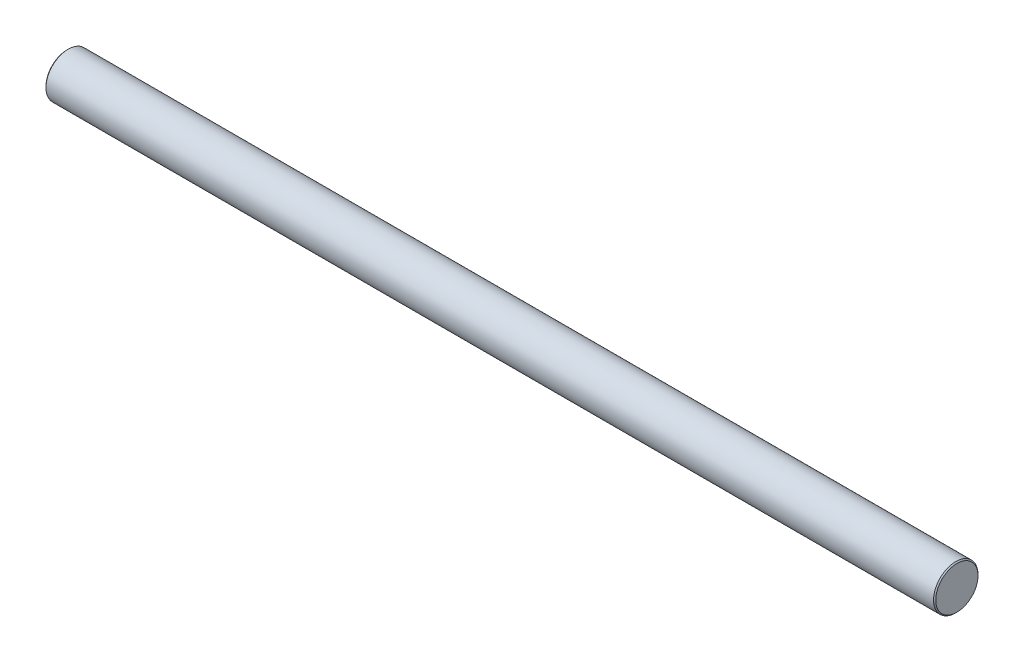
ISO-10303-21;
HEADER;
FILE_DESCRIPTION(('STEP AP214'),'2;1');
FILE_NAME('part.step','',(''),(''),'','','');
FILE_SCHEMA(('AUTOMOTIVE_DESIGN { 1 0 10303 214 1 1 1 1 }'));
ENDSEC;
DATA;
#1=APPLICATION_CONTEXT('core data for automotive mechanical design processes');
#2=APPLICATION_PROTOCOL_DEFINITION('international standard','automotive_design',2000,#1);
#3=PRODUCT_CONTEXT('',#1,'mechanical');
#4=PRODUCT('Part','Part','',(#3));
#5=PRODUCT_RELATED_PRODUCT_CATEGORY('part','',(#4));
#6=PRODUCT_DEFINITION_FORMATION('','',#4);
#7=PRODUCT_DEFINITION_CONTEXT('part definition',#1,'design');
#8=PRODUCT_DEFINITION('design','',#6,#7);
#9=PRODUCT_DEFINITION_SHAPE('','',#8);
#10=(LENGTH_UNIT() NAMED_UNIT(*) SI_UNIT(.MILLI.,.METRE.));
#11=(NAMED_UNIT(*) PLANE_ANGLE_UNIT() SI_UNIT($,.RADIAN.));
#12=(NAMED_UNIT(*) SI_UNIT($,.STERADIAN.) SOLID_ANGLE_UNIT());
#13=UNCERTAINTY_MEASURE_WITH_UNIT(LENGTH_MEASURE(1.E-05),#10,'distance_accuracy_value','');
#14=(GEOMETRIC_REPRESENTATION_CONTEXT(3) GLOBAL_UNCERTAINTY_ASSIGNED_CONTEXT((#13)) GLOBAL_UNIT_ASSIGNED_CONTEXT((#10,
#11,#12)) REPRESENTATION_CONTEXT('',''));
#15=CARTESIAN_POINT('',(0.,0.,0.));
#16=DIRECTION('',(0.,0.,1.));
#17=DIRECTION('',(1.,0.,0.));
#18=AXIS2_PLACEMENT_3D('',#15,#16,#17);
#19=CARTESIAN_POINT('',(40.,0.,0.));
#20=DIRECTION('',(-1.,0.,0.));
#21=DIRECTION('',(0.,0.,1.));
#22=AXIS2_PLACEMENT_3D('',#19,#20,#21);
#23=CYLINDRICAL_SURFACE('',#22,1.);
#24=CARTESIAN_POINT('',(0.0499999999999876,0.,0.));
#25=DIRECTION('',(1.,0.,0.));
#26=DIRECTION('',(0.,0.,-1.));
#27=AXIS2_PLACEMENT_3D('',#24,#25,#26);
#28=CIRCLE('',#27,1.);
#29=CARTESIAN_POINT('',(0.0499999999999876,0.,-1.));
#30=VERTEX_POINT('',#29);
#31=EDGE_CURVE('E42',#30,#30,#28,.T.);
#32=ORIENTED_EDGE('',*,*,#31,.T.);
#33=EDGE_LOOP('',(#32));
#34=FACE_BOUND('',#33,.T.);
#35=CARTESIAN_POINT('',(39.95,0.,0.));
#36=DIRECTION('',(1.,0.,0.));
#37=DIRECTION('',(0.,0.,-1.));
#38=AXIS2_PLACEMENT_3D('',#35,#36,#37);
#39=CIRCLE('',#38,1.);
#40=CARTESIAN_POINT('',(39.95,0.,-1.));
#41=VERTEX_POINT('',#40);
#42=EDGE_CURVE('E46',#41,#41,#39,.F.);
#43=ORIENTED_EDGE('',*,*,#42,.T.);
#44=EDGE_LOOP('',(#43));
#45=FACE_BOUND('',#44,.T.);
#46=ADVANCED_FACE('F31',(#34,#45),#23,.T.);
#47=CARTESIAN_POINT('',(40.,0.,0.));
#48=DIRECTION('',(1.,0.,0.));
#49=DIRECTION('',(0.,0.,-1.));
#50=AXIS2_PLACEMENT_3D('',#47,#48,#49);
#51=PLANE('',#50);
#52=CARTESIAN_POINT('',(40.,0.,0.));
#53=DIRECTION('',(1.,0.,0.));
#54=DIRECTION('',(0.,0.,-1.));
#55=AXIS2_PLACEMENT_3D('',#52,#53,#54);
#56=CIRCLE('',#55,0.95);
#57=CARTESIAN_POINT('',(40.,0.,-0.95));
#58=VERTEX_POINT('',#57);
#59=EDGE_CURVE('E10',#58,#58,#56,.T.);
#60=ORIENTED_EDGE('',*,*,#59,.T.);
#61=EDGE_LOOP('',(#60));
#62=FACE_BOUND('',#61,.T.);
#63=ADVANCED_FACE('F62',(#62),#51,.T.);
#64=CARTESIAN_POINT('',(0.,0.,0.));
#65=DIRECTION('',(1.,0.,0.));
#66=DIRECTION('',(0.,0.,-1.));
#67=AXIS2_PLACEMENT_3D('',#64,#65,#66);
#68=PLANE('',#67);
#69=CARTESIAN_POINT('',(0.,0.,0.));
#70=DIRECTION('',(1.,0.,0.));
#71=DIRECTION('',(0.,0.,-1.));
#72=AXIS2_PLACEMENT_3D('',#69,#70,#71);
#73=CIRCLE('',#72,0.950000000000013);
#74=CARTESIAN_POINT('',(0.,0.,-0.950000000000013));
#75=VERTEX_POINT('',#74);
#76=EDGE_CURVE('E38',#75,#75,#73,.F.);
#77=ORIENTED_EDGE('',*,*,#76,.T.);
#78=EDGE_LOOP('',(#77));
#79=FACE_BOUND('',#78,.T.);
#80=ADVANCED_FACE('F59',(#79),#68,.F.);
#81=CARTESIAN_POINT('',(0.0499999999999876,0.,0.));
#82=DIRECTION('',(1.,0.,0.));
#83=DIRECTION('',(0.,0.,-1.));
#84=AXIS2_PLACEMENT_3D('',#81,#82,#83);
#85=CONICAL_SURFACE('',#84,1.,0.78539816339744);
#86=CARTESIAN_POINT('',(0.,0.,-0.950000000000013));
#87=CARTESIAN_POINT('',(0.00052083333333317,0.,-0.950520833333347));
#88=CARTESIAN_POINT('',(0.00104166666666638,0.,-0.95104166666668));
#89=CARTESIAN_POINT('',(0.00208333333333281,0.,-0.952083333333346));
#90=CARTESIAN_POINT('',(0.00260416666666602,0.,-0.952604166666679));
#91=CARTESIAN_POINT('',(0.00364583333333243,0.,-0.953645833333346));
#92=CARTESIAN_POINT('',(0.00416666666666562,0.,-0.954166666666679));
#93=CARTESIAN_POINT('',(0.00520833333333203,0.,-0.955208333333345));
#94=CARTESIAN_POINT('',(0.00572916666666524,0.,-0.955729166666679));
#95=CARTESIAN_POINT('',(0.00677083333333164,0.,-0.956770833333345));
#96=CARTESIAN_POINT('',(0.00729166666666483,0.,-0.957291666666678));
#97=CARTESIAN_POINT('',(0.00833333333333124,0.,-0.958333333333344));
#98=CARTESIAN_POINT('',(0.00885416666666446,0.,-0.958854166666678));
#99=CARTESIAN_POINT('',(0.00989583333333087,0.,-0.959895833333344));
#100=CARTESIAN_POINT('',(0.0104166666666641,0.,-0.960416666666677));
#101=CARTESIAN_POINT('',(0.0114583333333305,0.,-0.961458333333344));
#102=CARTESIAN_POINT('',(0.0119791666666637,0.,-0.961979166666677));
#103=CARTESIAN_POINT('',(0.0130208333333301,0.,-0.963020833333343));
#104=CARTESIAN_POINT('',(0.0135416666666633,0.,-0.963541666666676));
#105=CARTESIAN_POINT('',(0.0145833333333297,0.,-0.964583333333343));
#106=CARTESIAN_POINT('',(0.0151041666666629,0.,-0.965104166666676));
#107=CARTESIAN_POINT('',(0.0161458333333293,0.,-0.966145833333342));
#108=CARTESIAN_POINT('',(0.0166666666666625,0.,-0.966666666666676));
#109=CARTESIAN_POINT('',(0.0177083333333289,0.,-0.967708333333342));
#110=CARTESIAN_POINT('',(0.0182291666666621,0.,-0.968229166666675));
#111=CARTESIAN_POINT('',(0.0192708333333285,0.,-0.969270833333342));
#112=CARTESIAN_POINT('',(0.0197916666666617,0.,-0.969791666666675));
#113=CARTESIAN_POINT('',(0.0208333333333281,0.,-0.970833333333341));
#114=CARTESIAN_POINT('',(0.0213541666666614,0.,-0.971354166666674));
#115=CARTESIAN_POINT('',(0.0223958333333278,0.,-0.972395833333341));
#116=CARTESIAN_POINT('',(0.022916666666661,0.,-0.972916666666674));
#117=CARTESIAN_POINT('',(0.0239583333333274,0.,-0.97395833333334));
#118=CARTESIAN_POINT('',(0.0244791666666606,0.,-0.974479166666674));
#119=CARTESIAN_POINT('',(0.025520833333327,0.,-0.97552083333334));
#120=CARTESIAN_POINT('',(0.0260416666666602,0.,-0.976041666666673));
#121=CARTESIAN_POINT('',(0.0270833333333266,0.,-0.97708333333334));
#122=CARTESIAN_POINT('',(0.0276041666666598,0.,-0.977604166666673));
#123=CARTESIAN_POINT('',(0.0286458333333262,0.,-0.978645833333339));
#124=CARTESIAN_POINT('',(0.0291666666666594,0.,-0.979166666666672));
#125=CARTESIAN_POINT('',(0.0302083333333258,0.,-0.980208333333339));
#126=CARTESIAN_POINT('',(0.030729166666659,0.,-0.980729166666672));
#127=CARTESIAN_POINT('',(0.0317708333333254,0.,-0.981770833333338));
#128=CARTESIAN_POINT('',(0.0322916666666586,0.,-0.982291666666671));
#129=CARTESIAN_POINT('',(0.033333333333325,0.,-0.983333333333338));
#130=CARTESIAN_POINT('',(0.0338541666666582,0.,-0.983854166666671));
#131=CARTESIAN_POINT('',(0.0348958333333246,0.,-0.984895833333337));
#132=CARTESIAN_POINT('',(0.0354166666666578,0.,-0.98541666666667));
#133=CARTESIAN_POINT('',(0.0364583333333243,0.,-0.986458333333337));
#134=CARTESIAN_POINT('',(0.0369791666666575,0.,-0.98697916666667));
#135=CARTESIAN_POINT('',(0.0380208333333239,0.,-0.988020833333337));
#136=CARTESIAN_POINT('',(0.0385416666666571,0.,-0.98854166666667));
#137=CARTESIAN_POINT('',(0.0395833333333235,0.,-0.989583333333336));
#138=CARTESIAN_POINT('',(0.0401041666666567,0.,-0.990104166666669));
#139=CARTESIAN_POINT('',(0.0411458333333231,0.,-0.991145833333336));
#140=CARTESIAN_POINT('',(0.0416666666666563,0.,-0.991666666666669));
#141=CARTESIAN_POINT('',(0.0427083333333227,0.,-0.992708333333335));
#142=CARTESIAN_POINT('',(0.0432291666666559,0.,-0.993229166666668));
#143=CARTESIAN_POINT('',(0.0442708333333223,0.,-0.994270833333335));
#144=CARTESIAN_POINT('',(0.0447916666666555,0.,-0.994791666666668));
#145=CARTESIAN_POINT('',(0.045833333333322,0.,-0.995833333333334));
#146=CARTESIAN_POINT('',(0.0463541666666551,0.,-0.996354166666668));
#147=CARTESIAN_POINT('',(0.0473958333333215,0.,-0.997395833333334));
#148=CARTESIAN_POINT('',(0.0479166666666547,0.,-0.997916666666667));
#149=CARTESIAN_POINT('',(0.0489583333333211,0.,-0.998958333333334));
#150=CARTESIAN_POINT('',(0.0494791666666544,0.,-0.999479166666667));
#151=CARTESIAN_POINT('',(0.0499999999999876,0.,-1.));
#152=B_SPLINE_CURVE_WITH_KNOTS('',3,(#86,#87,#88,#89,#90,#91,#92,#93,#94,#95,#96,#97,#98,#99,
#100,#101,#102,#103,#104,#105,#106,#107,#108,#109,#110,#111,#112,#113,#114,#115,#116,#117,#118,
#119,#120,#121,#122,#123,#124,#125,#126,#127,#128,#129,#130,#131,#132,#133,#134,#135,#136,#137,
#138,#139,#140,#141,#142,#143,#144,#145,#146,#147,#148,#149,#150,#151),.UNSPECIFIED.,.F.,.F.,(4,
2,2,2,2,2,2,2,2,2,2,2,2,2,2,2,2,2,2,2,2,2,2,2,2,2,2,2,2,2,2,2,4),(0.,0.00220970869120741,
0.00441941738241475,0.00662912607362216,0.00883883476482957,0.011048543456037,
0.0132582521472443,0.0154679608384517,0.0176776695296591,0.0198873782208665,0.0220970869120739,
0.0243067956032813,0.0265165042944887,0.0287262129856961,0.0309359216769035,0.0331456303681109,
0.0353553390593183,0.0375650477505257,0.0397747564417331,0.0419844651329405,0.0441941738241478,
0.0464038825153552,0.0486135912065626,0.05082329989777,0.0530330085889774,0.0552427172801848,
0.0574524259713922,0.0596621346625996,0.061871843353807,0.0640815520450143,0.0662912607362217,
0.0685009694274291,0.0707106781186365),.UNSPECIFIED.);
#153=EDGE_CURVE('BSEAM55',#75,#30,#152,.T.);
#154=ORIENTED_EDGE('',*,*,#76,.F.);
#155=ORIENTED_EDGE('',*,*,#31,.F.);
#156=ORIENTED_EDGE('',*,*,#153,.T.);
#157=ORIENTED_EDGE('',*,*,#153,.F.);
#158=EDGE_LOOP('',(#154,#156,#155,#157));
#159=FACE_BOUND('',#158,.T.);
#160=ADVANCED_FACE('F55',(#159),#85,.T.);
#161=CARTESIAN_POINT('',(40.,0.,0.));
#162=DIRECTION('',(-1.,0.,0.));
#163=DIRECTION('',(0.,0.,1.));
#164=AXIS2_PLACEMENT_3D('',#161,#162,#163);
#165=CONICAL_SURFACE('',#164,0.95,0.78539816339737);
#166=ORIENTED_EDGE('',*,*,#42,.F.);
#167=EDGE_LOOP('',(#166));
#168=FACE_BOUND('',#167,.T.);
#169=ORIENTED_EDGE('',*,*,#59,.F.);
#170=EDGE_LOOP('',(#169));
#171=FACE_BOUND('',#170,.T.);
#172=ADVANCED_FACE('F33',(#168,#171),#165,.T.);
#173=CLOSED_SHELL('',(#46,#63,#80,#160,#172));
#174=MANIFOLD_SOLID_BREP('B2',#173);
#175=ADVANCED_BREP_SHAPE_REPRESENTATION('',(#18,#174),#14);
#176=SHAPE_DEFINITION_REPRESENTATION(#9,#175);
ENDSEC;
END-ISO-10303-21;
